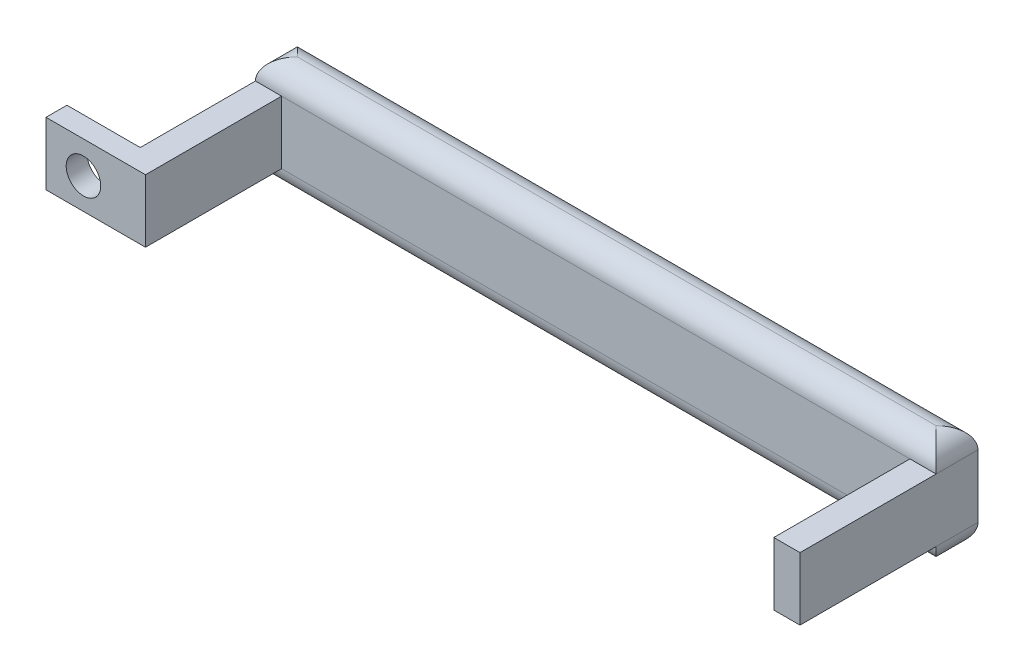
ISO-10303-21;
HEADER;
FILE_DESCRIPTION(('STEP AP214'),'2;1');
FILE_NAME('part.step','',(''),(''),'','','');
FILE_SCHEMA(('AUTOMOTIVE_DESIGN { 1 0 10303 214 1 1 1 1 }'));
ENDSEC;
DATA;
#1=APPLICATION_CONTEXT('core data for automotive mechanical design processes');
#2=APPLICATION_PROTOCOL_DEFINITION('international standard','automotive_design',2000,#1);
#3=PRODUCT_CONTEXT('',#1,'mechanical');
#4=PRODUCT('Part','Part','',(#3));
#5=PRODUCT_RELATED_PRODUCT_CATEGORY('part','',(#4));
#6=PRODUCT_DEFINITION_FORMATION('','',#4);
#7=PRODUCT_DEFINITION_CONTEXT('part definition',#1,'design');
#8=PRODUCT_DEFINITION('design','',#6,#7);
#9=PRODUCT_DEFINITION_SHAPE('','',#8);
#10=(LENGTH_UNIT() NAMED_UNIT(*) SI_UNIT(.MILLI.,.METRE.));
#11=(NAMED_UNIT(*) PLANE_ANGLE_UNIT() SI_UNIT($,.RADIAN.));
#12=(NAMED_UNIT(*) SI_UNIT($,.STERADIAN.) SOLID_ANGLE_UNIT());
#13=UNCERTAINTY_MEASURE_WITH_UNIT(LENGTH_MEASURE(1.E-05),#10,'distance_accuracy_value','');
#14=(GEOMETRIC_REPRESENTATION_CONTEXT(3) GLOBAL_UNCERTAINTY_ASSIGNED_CONTEXT((#13)) GLOBAL_UNIT_ASSIGNED_CONTEXT((#10,
#11,#12)) REPRESENTATION_CONTEXT('',''));
#15=CARTESIAN_POINT('',(0.,0.,0.));
#16=DIRECTION('',(0.,0.,1.));
#17=DIRECTION('',(1.,0.,0.));
#18=AXIS2_PLACEMENT_3D('',#15,#16,#17);
#19=CARTESIAN_POINT('',(0.,0.,4.));
#20=DIRECTION('',(0.,0.,1.));
#21=DIRECTION('',(1.,0.,0.));
#22=AXIS2_PLACEMENT_3D('',#19,#20,#21);
#23=PLANE('',#22);
#24=DIRECTION('',(-1.,0.,0.));
#25=VECTOR('',#24,1.);
#26=CARTESIAN_POINT('',(-38.0590062111801,10.1583850931677,4.));
#27=LINE('',#26,#25);
#28=CARTESIAN_POINT('',(24.4409937888199,10.1583850931677,4.));
#29=VERTEX_POINT('',#28);
#30=CARTESIAN_POINT('',(-35.5590062111801,10.1583850931677,4.));
#31=VERTEX_POINT('',#30);
#32=EDGE_CURVE('E225',#29,#31,#27,.T.);
#33=ORIENTED_EDGE('',*,*,#32,.T.);
#34=DIRECTION('',(0.,1.,0.));
#35=VECTOR('',#34,1.);
#36=CARTESIAN_POINT('',(-35.5590062111801,10.1583850931677,4.));
#37=LINE('',#36,#35);
#38=CARTESIAN_POINT('',(-35.5590062111801,4.1583850931677,4.));
#39=VERTEX_POINT('',#38);
#40=EDGE_CURVE('E201',#39,#31,#37,.T.);
#41=ORIENTED_EDGE('',*,*,#40,.F.);
#42=DIRECTION('',(1.,0.,0.));
#43=VECTOR('',#42,1.);
#44=CARTESIAN_POINT('',(26.9409937888199,4.1583850931677,4.));
#45=LINE('',#44,#43);
#46=CARTESIAN_POINT('',(24.4409937888199,4.1583850931677,4.));
#47=VERTEX_POINT('',#46);
#48=EDGE_CURVE('E221',#39,#47,#45,.T.);
#49=ORIENTED_EDGE('',*,*,#48,.T.);
#50=DIRECTION('',(0.,-1.,0.));
#51=VECTOR('',#50,1.);
#52=CARTESIAN_POINT('',(24.4409937888199,10.1583850931677,4.));
#53=LINE('',#52,#51);
#54=EDGE_CURVE('E65',#29,#47,#53,.T.);
#55=ORIENTED_EDGE('',*,*,#54,.F.);
#56=EDGE_LOOP('',(#33,#41,#49,#55));
#57=FACE_BOUND('',#56,.T.);
#58=ADVANCED_FACE('F41',(#57),#23,.T.);
#59=CARTESIAN_POINT('',(-38.0590062111801,12.1583850931677,4.));
#60=DIRECTION('',(1.,0.,0.));
#61=DIRECTION('',(0.,0.,-1.));
#62=AXIS2_PLACEMENT_3D('',#59,#60,#61);
#63=PLANE('',#62);
#64=DIRECTION('',(0.,0.,-1.));
#65=VECTOR('',#64,1.);
#66=CARTESIAN_POINT('',(-38.0590062111801,4.1583850931677,17.));
#67=LINE('',#66,#65);
#68=CARTESIAN_POINT('',(-38.0590062111801,4.1583850931677,15.));
#69=VERTEX_POINT('',#68);
#70=CARTESIAN_POINT('',(-38.0590062111801,4.1583850931677,4.));
#71=VERTEX_POINT('',#70);
#72=EDGE_CURVE('E163',#69,#71,#67,.T.);
#73=ORIENTED_EDGE('',*,*,#72,.F.);
#74=DIRECTION('',(0.,1.,0.));
#75=VECTOR('',#74,1.);
#76=CARTESIAN_POINT('',(-38.0590062111801,10.1583850931677,15.));
#77=LINE('',#76,#75);
#78=CARTESIAN_POINT('',(-38.0590062111801,10.1583850931677,15.));
#79=VERTEX_POINT('',#78);
#80=EDGE_CURVE('E149',#69,#79,#77,.T.);
#81=ORIENTED_EDGE('',*,*,#80,.T.);
#82=DIRECTION('',(0.,0.,-1.));
#83=VECTOR('',#82,1.);
#84=CARTESIAN_POINT('',(-38.0590062111801,10.1583850931677,17.));
#85=LINE('',#84,#83);
#86=CARTESIAN_POINT('',(-38.0590062111801,10.1583850931677,4.));
#87=VERTEX_POINT('',#86);
#88=EDGE_CURVE('E160',#79,#87,#85,.T.);
#89=ORIENTED_EDGE('',*,*,#88,.T.);
#90=DIRECTION('',(0.,0.,-1.));
#91=VECTOR('',#90,1.);
#92=CARTESIAN_POINT('',(-38.0590062111801,10.1583850931677,4.));
#93=LINE('',#92,#91);
#94=CARTESIAN_POINT('',(-38.0590062111801,10.1583850931677,0.));
#95=VERTEX_POINT('',#94);
#96=EDGE_CURVE('E231',#87,#95,#93,.T.);
#97=ORIENTED_EDGE('',*,*,#96,.T.);
#98=DIRECTION('',(0.,-1.,0.));
#99=VECTOR('',#98,1.);
#100=CARTESIAN_POINT('',(-38.0590062111801,12.1583850931677,0.));
#101=LINE('',#100,#99);
#102=CARTESIAN_POINT('',(-38.0590062111801,4.1583850931677,0.));
#103=VERTEX_POINT('',#102);
#104=EDGE_CURVE('E209',#95,#103,#101,.T.);
#105=ORIENTED_EDGE('',*,*,#104,.T.);
#106=DIRECTION('',(0.,0.,-1.));
#107=VECTOR('',#106,1.);
#108=CARTESIAN_POINT('',(-38.0590062111801,4.1583850931677,4.));
#109=LINE('',#108,#107);
#110=EDGE_CURVE('E229',#103,#71,#109,.F.);
#111=ORIENTED_EDGE('',*,*,#110,.T.);
#112=EDGE_LOOP('',(#73,#81,#89,#97,#105,#111));
#113=FACE_BOUND('',#112,.T.);
#114=ADVANCED_FACE('F159',(#113),#63,.F.);
#115=CARTESIAN_POINT('',(26.9409937888199,12.1583850931677,4.));
#116=DIRECTION('',(-1.,0.,0.));
#117=DIRECTION('',(0.,0.,1.));
#118=AXIS2_PLACEMENT_3D('',#115,#116,#117);
#119=PLANE('',#118);
#120=DIRECTION('',(0.,1.,0.));
#121=VECTOR('',#120,1.);
#122=CARTESIAN_POINT('',(26.9409937888199,12.1583850931677,0.));
#123=LINE('',#122,#121);
#124=CARTESIAN_POINT('',(26.9409937888199,4.1583850931677,0.));
#125=VERTEX_POINT('',#124);
#126=CARTESIAN_POINT('',(26.9409937888199,10.1583850931677,0.));
#127=VERTEX_POINT('',#126);
#128=EDGE_CURVE('E212',#125,#127,#123,.T.);
#129=ORIENTED_EDGE('',*,*,#128,.T.);
#130=DIRECTION('',(0.,0.,-1.));
#131=VECTOR('',#130,1.);
#132=CARTESIAN_POINT('',(26.9409937888199,10.1583850931677,4.));
#133=LINE('',#132,#131);
#134=CARTESIAN_POINT('',(26.9409937888199,10.1583850931677,4.));
#135=VERTEX_POINT('',#134);
#136=EDGE_CURVE('E218',#127,#135,#133,.F.);
#137=ORIENTED_EDGE('',*,*,#136,.T.);
#138=DIRECTION('',(0.,0.,-1.));
#139=VECTOR('',#138,1.);
#140=CARTESIAN_POINT('',(26.9409937888199,10.1583850931677,17.));
#141=LINE('',#140,#139);
#142=CARTESIAN_POINT('',(26.9409937888199,10.1583850931677,17.));
#143=VERTEX_POINT('',#142);
#144=EDGE_CURVE('E182',#143,#135,#141,.T.);
#145=ORIENTED_EDGE('',*,*,#144,.F.);
#146=DIRECTION('',(0.,1.,0.));
#147=VECTOR('',#146,1.);
#148=CARTESIAN_POINT('',(26.9409937888199,10.1583850931677,17.));
#149=LINE('',#148,#147);
#150=CARTESIAN_POINT('',(26.9409937888199,4.1583850931677,17.));
#151=VERTEX_POINT('',#150);
#152=EDGE_CURVE('E199',#151,#143,#149,.T.);
#153=ORIENTED_EDGE('',*,*,#152,.F.);
#154=DIRECTION('',(0.,0.,-1.));
#155=VECTOR('',#154,1.);
#156=CARTESIAN_POINT('',(26.9409937888199,4.1583850931677,17.));
#157=LINE('',#156,#155);
#158=CARTESIAN_POINT('',(26.9409937888199,4.1583850931677,4.));
#159=VERTEX_POINT('',#158);
#160=EDGE_CURVE('E192',#151,#159,#157,.T.);
#161=ORIENTED_EDGE('',*,*,#160,.T.);
#162=DIRECTION('',(0.,0.,-1.));
#163=VECTOR('',#162,1.);
#164=CARTESIAN_POINT('',(26.9409937888199,4.1583850931677,4.));
#165=LINE('',#164,#163);
#166=EDGE_CURVE('E216',#159,#125,#165,.T.);
#167=ORIENTED_EDGE('',*,*,#166,.T.);
#168=EDGE_LOOP('',(#129,#137,#145,#153,#161,#167));
#169=FACE_BOUND('',#168,.T.);
#170=ADVANCED_FACE('F271',(#169),#119,.F.);
#171=CARTESIAN_POINT('',(0.,0.,0.));
#172=DIRECTION('',(0.,0.,1.));
#173=DIRECTION('',(1.,0.,0.));
#174=AXIS2_PLACEMENT_3D('',#171,#172,#173);
#175=PLANE('',#174);
#176=ORIENTED_EDGE('',*,*,#104,.F.);
#177=DIRECTION('',(-1.,0.,0.));
#178=VECTOR('',#177,1.);
#179=CARTESIAN_POINT('',(0.,10.1583850931677,0.));
#180=LINE('',#179,#178);
#181=EDGE_CURVE('E11',#95,#127,#180,.F.);
#182=ORIENTED_EDGE('',*,*,#181,.T.);
#183=ORIENTED_EDGE('',*,*,#128,.F.);
#184=DIRECTION('',(1.,0.,0.));
#185=VECTOR('',#184,1.);
#186=CARTESIAN_POINT('',(0.,4.1583850931677,0.));
#187=LINE('',#186,#185);
#188=EDGE_CURVE('E50',#125,#103,#187,.F.);
#189=ORIENTED_EDGE('',*,*,#188,.T.);
#190=EDGE_LOOP('',(#176,#182,#183,#189));
#191=FACE_BOUND('',#190,.T.);
#192=ADVANCED_FACE('F298',(#191),#175,.F.);
#193=CARTESIAN_POINT('',(-36.0590062111801,10.1583850931677,4.));
#194=DIRECTION('',(0.,0.,-1.));
#195=DIRECTION('',(-1.,0.,0.));
#196=AXIS2_PLACEMENT_3D('',#193,#194,#195);
#197=CYLINDRICAL_SURFACE('',#196,2.);
#198=CARTESIAN_POINT('',(-36.0590062111801,10.1583850931677,2.));
#199=DIRECTION('',(-0.707106781186547,0.,0.707106781186547));
#200=DIRECTION('',(-0.707106781186547,0.,-0.707106781186547));
#201=AXIS2_PLACEMENT_3D('',#198,#199,#200);
#202=ELLIPSE('',#201,2.82842712474619,2.);
#203=CARTESIAN_POINT('',(-36.0590062111801,12.1583850931677,2.));
#204=VERTEX_POINT('',#203);
#205=EDGE_CURVE('E239',#95,#204,#202,.F.);
#206=ORIENTED_EDGE('',*,*,#205,.F.);
#207=ORIENTED_EDGE('',*,*,#96,.F.);
#208=CARTESIAN_POINT('',(-36.0590062111801,10.1583850931677,2.));
#209=DIRECTION('',(-0.707106781186547,0.,-0.707106781186547));
#210=DIRECTION('',(0.707106781186547,0.,-0.707106781186547));
#211=AXIS2_PLACEMENT_3D('',#208,#209,#210);
#212=ELLIPSE('',#211,2.82842712474619,2.);
#213=EDGE_CURVE('E213',#204,#87,#212,.F.);
#214=ORIENTED_EDGE('',*,*,#213,.F.);
#215=EDGE_LOOP('',(#206,#207,#214));
#216=FACE_BOUND('',#215,.T.);
#217=ADVANCED_FACE('F294',(#216),#197,.T.);
#218=CARTESIAN_POINT('',(0.,10.1583850931677,2.));
#219=DIRECTION('',(1.,0.,0.));
#220=DIRECTION('',(0.,0.,-1.));
#221=AXIS2_PLACEMENT_3D('',#218,#219,#220);
#222=CYLINDRICAL_SURFACE('',#221,2.);
#223=DIRECTION('',(-1.,0.,0.));
#224=VECTOR('',#223,1.);
#225=CARTESIAN_POINT('',(26.9409937888199,12.1583850931677,2.));
#226=LINE('',#225,#224);
#227=CARTESIAN_POINT('',(24.9409937888199,12.1583850931677,2.));
#228=VERTEX_POINT('',#227);
#229=EDGE_CURVE('E242',#204,#228,#226,.F.);
#230=ORIENTED_EDGE('',*,*,#229,.F.);
#231=ORIENTED_EDGE('',*,*,#213,.T.);
#232=DIRECTION('',(-1.,0.,0.));
#233=VECTOR('',#232,1.);
#234=CARTESIAN_POINT('',(-38.0590062111801,10.1583850931677,4.));
#235=LINE('',#234,#233);
#236=EDGE_CURVE('E58',#31,#87,#235,.T.);
#237=ORIENTED_EDGE('',*,*,#236,.F.);
#238=ORIENTED_EDGE('',*,*,#32,.F.);
#239=EDGE_CURVE('E226',#135,#29,#27,.T.);
#240=ORIENTED_EDGE('',*,*,#239,.F.);
#241=CARTESIAN_POINT('',(24.9409937888199,10.1583850931677,2.));
#242=DIRECTION('',(0.707106781186547,0.,-0.707106781186547));
#243=DIRECTION('',(0.707106781186547,0.,0.707106781186547));
#244=AXIS2_PLACEMENT_3D('',#241,#242,#243);
#245=ELLIPSE('',#244,2.82842712474619,2.);
#246=EDGE_CURVE('E237',#228,#135,#245,.T.);
#247=ORIENTED_EDGE('',*,*,#246,.F.);
#248=EDGE_LOOP('',(#230,#231,#237,#238,#240,#247));
#249=FACE_BOUND('',#248,.T.);
#250=ADVANCED_FACE('F284',(#249),#222,.T.);
#251=CARTESIAN_POINT('',(-38.0590062111801,10.1583850931677,2.));
#252=DIRECTION('',(-1.,0.,0.));
#253=DIRECTION('',(0.,0.,1.));
#254=AXIS2_PLACEMENT_3D('',#251,#252,#253);
#255=CYLINDRICAL_SURFACE('',#254,2.);
#256=ORIENTED_EDGE('',*,*,#205,.T.);
#257=ORIENTED_EDGE('',*,*,#229,.T.);
#258=CARTESIAN_POINT('',(24.9409937888199,10.1583850931677,2.));
#259=DIRECTION('',(-0.707106781186547,0.,-0.707106781186547));
#260=DIRECTION('',(-0.707106781186547,0.,0.707106781186547));
#261=AXIS2_PLACEMENT_3D('',#258,#259,#260);
#262=ELLIPSE('',#261,2.82842712474619,2.);
#263=EDGE_CURVE('E234',#127,#228,#262,.F.);
#264=ORIENTED_EDGE('',*,*,#263,.F.);
#265=ORIENTED_EDGE('',*,*,#181,.F.);
#266=EDGE_LOOP('',(#256,#257,#264,#265));
#267=FACE_BOUND('',#266,.T.);
#268=ADVANCED_FACE('F291',(#267),#255,.T.);
#269=CARTESIAN_POINT('',(24.9409937888199,10.1583850931677,4.));
#270=DIRECTION('',(0.,0.,-1.));
#271=DIRECTION('',(-1.,0.,0.));
#272=AXIS2_PLACEMENT_3D('',#269,#270,#271);
#273=CYLINDRICAL_SURFACE('',#272,2.);
#274=ORIENTED_EDGE('',*,*,#246,.T.);
#275=ORIENTED_EDGE('',*,*,#136,.F.);
#276=ORIENTED_EDGE('',*,*,#263,.T.);
#277=EDGE_LOOP('',(#274,#275,#276));
#278=FACE_BOUND('',#277,.T.);
#279=ADVANCED_FACE('F288',(#278),#273,.T.);
#280=CARTESIAN_POINT('',(24.9409937888199,4.1583850931677,4.));
#281=DIRECTION('',(0.,0.,-1.));
#282=DIRECTION('',(-1.,0.,0.));
#283=AXIS2_PLACEMENT_3D('',#280,#281,#282);
#284=CYLINDRICAL_SURFACE('',#283,2.);
#285=CARTESIAN_POINT('',(24.9409937888199,4.1583850931677,2.));
#286=DIRECTION('',(0.707106781186547,0.,0.707106781186547));
#287=DIRECTION('',(0.707106781186547,0.,-0.707106781186547));
#288=AXIS2_PLACEMENT_3D('',#285,#286,#287);
#289=ELLIPSE('',#288,2.82842712474619,2.);
#290=CARTESIAN_POINT('',(24.9409937888199,2.1583850931677,2.));
#291=VERTEX_POINT('',#290);
#292=EDGE_CURVE('E250',#125,#291,#289,.F.);
#293=ORIENTED_EDGE('',*,*,#292,.F.);
#294=ORIENTED_EDGE('',*,*,#166,.F.);
#295=CARTESIAN_POINT('',(24.9409937888199,4.1583850931677,2.));
#296=DIRECTION('',(0.707106781186547,0.,-0.707106781186547));
#297=DIRECTION('',(-0.707106781186547,0.,-0.707106781186547));
#298=AXIS2_PLACEMENT_3D('',#295,#296,#297);
#299=ELLIPSE('',#298,2.82842712474619,2.);
#300=EDGE_CURVE('E45',#291,#159,#299,.F.);
#301=ORIENTED_EDGE('',*,*,#300,.F.);
#302=EDGE_LOOP('',(#293,#294,#301));
#303=FACE_BOUND('',#302,.T.);
#304=ADVANCED_FACE('F43',(#303),#284,.T.);
#305=CARTESIAN_POINT('',(0.,4.1583850931677,2.));
#306=DIRECTION('',(-1.,0.,0.));
#307=DIRECTION('',(0.,-1.,0.));
#308=AXIS2_PLACEMENT_3D('',#305,#306,#307);
#309=CYLINDRICAL_SURFACE('',#308,2.);
#310=DIRECTION('',(1.,0.,0.));
#311=VECTOR('',#310,1.);
#312=CARTESIAN_POINT('',(-38.0590062111801,2.1583850931677,2.));
#313=LINE('',#312,#311);
#314=CARTESIAN_POINT('',(-36.0590062111801,2.1583850931677,2.));
#315=VERTEX_POINT('',#314);
#316=EDGE_CURVE('E252',#291,#315,#313,.F.);
#317=ORIENTED_EDGE('',*,*,#316,.F.);
#318=ORIENTED_EDGE('',*,*,#300,.T.);
#319=DIRECTION('',(1.,0.,0.));
#320=VECTOR('',#319,1.);
#321=CARTESIAN_POINT('',(26.9409937888199,4.1583850931677,4.));
#322=LINE('',#321,#320);
#323=EDGE_CURVE('E196',#47,#159,#322,.T.);
#324=ORIENTED_EDGE('',*,*,#323,.F.);
#325=ORIENTED_EDGE('',*,*,#48,.F.);
#326=EDGE_CURVE('E222',#71,#39,#45,.T.);
#327=ORIENTED_EDGE('',*,*,#326,.F.);
#328=CARTESIAN_POINT('',(-36.0590062111801,4.1583850931677,2.));
#329=DIRECTION('',(-0.707106781186547,0.,-0.707106781186547));
#330=DIRECTION('',(-0.707106781186547,0.,0.707106781186547));
#331=AXIS2_PLACEMENT_3D('',#328,#329,#330);
#332=ELLIPSE('',#331,2.82842712474619,2.);
#333=EDGE_CURVE('E247',#315,#71,#332,.T.);
#334=ORIENTED_EDGE('',*,*,#333,.F.);
#335=EDGE_LOOP('',(#317,#318,#324,#325,#327,#334));
#336=FACE_BOUND('',#335,.T.);
#337=ADVANCED_FACE('F259',(#336),#309,.T.);
#338=CARTESIAN_POINT('',(-38.0590062111801,4.1583850931677,2.));
#339=DIRECTION('',(1.,0.,0.));
#340=DIRECTION('',(0.,1.,0.));
#341=AXIS2_PLACEMENT_3D('',#338,#339,#340);
#342=CYLINDRICAL_SURFACE('',#341,2.);
#343=ORIENTED_EDGE('',*,*,#292,.T.);
#344=ORIENTED_EDGE('',*,*,#316,.T.);
#345=CARTESIAN_POINT('',(-36.0590062111801,4.1583850931677,2.));
#346=DIRECTION('',(0.707106781186547,0.,-0.707106781186547));
#347=DIRECTION('',(0.707106781186547,0.,0.707106781186547));
#348=AXIS2_PLACEMENT_3D('',#345,#346,#347);
#349=ELLIPSE('',#348,2.82842712474619,2.);
#350=EDGE_CURVE('E181',#103,#315,#349,.F.);
#351=ORIENTED_EDGE('',*,*,#350,.F.);
#352=ORIENTED_EDGE('',*,*,#188,.F.);
#353=EDGE_LOOP('',(#343,#344,#351,#352));
#354=FACE_BOUND('',#353,.T.);
#355=ADVANCED_FACE('F299',(#354),#342,.T.);
#356=CARTESIAN_POINT('',(-36.0590062111801,4.1583850931677,4.));
#357=DIRECTION('',(0.,0.,-1.));
#358=DIRECTION('',(-1.,0.,0.));
#359=AXIS2_PLACEMENT_3D('',#356,#357,#358);
#360=CYLINDRICAL_SURFACE('',#359,2.);
#361=ORIENTED_EDGE('',*,*,#333,.T.);
#362=ORIENTED_EDGE('',*,*,#110,.F.);
#363=ORIENTED_EDGE('',*,*,#350,.T.);
#364=EDGE_LOOP('',(#361,#362,#363));
#365=FACE_BOUND('',#364,.T.);
#366=ADVANCED_FACE('F301',(#365),#360,.T.);
#367=CARTESIAN_POINT('',(26.9409937888199,10.1583850931677,17.));
#368=DIRECTION('',(0.,-1.,0.));
#369=DIRECTION('',(0.,0.,-1.));
#370=AXIS2_PLACEMENT_3D('',#367,#368,#369);
#371=PLANE('',#370);
#372=ORIENTED_EDGE('',*,*,#239,.T.);
#373=DIRECTION('',(0.,0.,-1.));
#374=VECTOR('',#373,1.);
#375=CARTESIAN_POINT('',(24.4409937888199,10.1583850931677,17.));
#376=LINE('',#375,#374);
#377=CARTESIAN_POINT('',(24.4409937888199,10.1583850931677,17.));
#378=VERTEX_POINT('',#377);
#379=EDGE_CURVE('E185',#378,#29,#376,.T.);
#380=ORIENTED_EDGE('',*,*,#379,.F.);
#381=DIRECTION('',(-1.,0.,0.));
#382=VECTOR('',#381,1.);
#383=CARTESIAN_POINT('',(26.9409937888199,10.1583850931677,17.));
#384=LINE('',#383,#382);
#385=EDGE_CURVE('E205',#143,#378,#384,.T.);
#386=ORIENTED_EDGE('',*,*,#385,.F.);
#387=ORIENTED_EDGE('',*,*,#144,.T.);
#388=EDGE_LOOP('',(#372,#380,#386,#387));
#389=FACE_BOUND('',#388,.T.);
#390=ADVANCED_FACE('F280',(#389),#371,.F.);
#391=CARTESIAN_POINT('',(24.4409937888199,10.1583850931677,17.));
#392=DIRECTION('',(1.,0.,0.));
#393=DIRECTION('',(0.,0.,-1.));
#394=AXIS2_PLACEMENT_3D('',#391,#392,#393);
#395=PLANE('',#394);
#396=ORIENTED_EDGE('',*,*,#54,.T.);
#397=DIRECTION('',(0.,0.,-1.));
#398=VECTOR('',#397,1.);
#399=CARTESIAN_POINT('',(24.4409937888199,4.1583850931677,17.));
#400=LINE('',#399,#398);
#401=CARTESIAN_POINT('',(24.4409937888199,4.1583850931677,17.));
#402=VERTEX_POINT('',#401);
#403=EDGE_CURVE('E189',#402,#47,#400,.T.);
#404=ORIENTED_EDGE('',*,*,#403,.F.);
#405=DIRECTION('',(0.,-1.,0.));
#406=VECTOR('',#405,1.);
#407=CARTESIAN_POINT('',(24.4409937888199,10.1583850931677,17.));
#408=LINE('',#407,#406);
#409=EDGE_CURVE('E203',#378,#402,#408,.T.);
#410=ORIENTED_EDGE('',*,*,#409,.F.);
#411=ORIENTED_EDGE('',*,*,#379,.T.);
#412=EDGE_LOOP('',(#396,#404,#410,#411));
#413=FACE_BOUND('',#412,.T.);
#414=ADVANCED_FACE('F278',(#413),#395,.F.);
#415=CARTESIAN_POINT('',(26.9409937888199,4.1583850931677,17.));
#416=DIRECTION('',(0.,1.,0.));
#417=DIRECTION('',(-1.,0.,0.));
#418=AXIS2_PLACEMENT_3D('',#415,#416,#417);
#419=PLANE('',#418);
#420=ORIENTED_EDGE('',*,*,#323,.T.);
#421=ORIENTED_EDGE('',*,*,#160,.F.);
#422=DIRECTION('',(1.,0.,0.));
#423=VECTOR('',#422,1.);
#424=CARTESIAN_POINT('',(26.9409937888199,4.1583850931677,17.));
#425=LINE('',#424,#423);
#426=EDGE_CURVE('E195',#402,#151,#425,.T.);
#427=ORIENTED_EDGE('',*,*,#426,.F.);
#428=ORIENTED_EDGE('',*,*,#403,.T.);
#429=EDGE_LOOP('',(#420,#421,#427,#428));
#430=FACE_BOUND('',#429,.T.);
#431=ADVANCED_FACE('F267',(#430),#419,.F.);
#432=CARTESIAN_POINT('',(0.,0.,17.));
#433=DIRECTION('',(0.,0.,-1.));
#434=DIRECTION('',(-1.,0.,0.));
#435=AXIS2_PLACEMENT_3D('',#432,#433,#434);
#436=PLANE('',#435);
#437=ORIENTED_EDGE('',*,*,#152,.T.);
#438=ORIENTED_EDGE('',*,*,#385,.T.);
#439=ORIENTED_EDGE('',*,*,#409,.T.);
#440=ORIENTED_EDGE('',*,*,#426,.T.);
#441=EDGE_LOOP('',(#437,#438,#439,#440));
#442=FACE_BOUND('',#441,.T.);
#443=ADVANCED_FACE('F274',(#442),#436,.F.);
#444=CARTESIAN_POINT('',(-38.0590062111801,4.1583850931677,17.));
#445=DIRECTION('',(0.,1.,0.));
#446=DIRECTION('',(0.,0.,1.));
#447=AXIS2_PLACEMENT_3D('',#444,#445,#446);
#448=PLANE('',#447);
#449=ORIENTED_EDGE('',*,*,#326,.T.);
#450=DIRECTION('',(0.,0.,-1.));
#451=VECTOR('',#450,1.);
#452=CARTESIAN_POINT('',(-35.5590062111801,4.1583850931677,17.));
#453=LINE('',#452,#451);
#454=CARTESIAN_POINT('',(-35.5590062111801,4.1583850931677,17.));
#455=VERTEX_POINT('',#454);
#456=EDGE_CURVE('E171',#455,#39,#453,.T.);
#457=ORIENTED_EDGE('',*,*,#456,.F.);
#458=DIRECTION('',(1.,0.,0.));
#459=VECTOR('',#458,1.);
#460=CARTESIAN_POINT('',(-38.0590062111801,4.1583850931677,17.));
#461=LINE('',#460,#459);
#462=CARTESIAN_POINT('',(-45.0590062111801,4.1583850931677,17.));
#463=VERTEX_POINT('',#462);
#464=EDGE_CURVE('E314',#463,#455,#461,.T.);
#465=ORIENTED_EDGE('',*,*,#464,.F.);
#466=DIRECTION('',(0.,0.,1.));
#467=VECTOR('',#466,1.);
#468=CARTESIAN_POINT('',(-45.0590062111801,4.1583850931677,15.));
#469=LINE('',#468,#467);
#470=CARTESIAN_POINT('',(-45.0590062111801,4.1583850931677,15.));
#471=VERTEX_POINT('',#470);
#472=EDGE_CURVE('E186',#471,#463,#469,.T.);
#473=ORIENTED_EDGE('',*,*,#472,.F.);
#474=DIRECTION('',(1.,0.,0.));
#475=VECTOR('',#474,1.);
#476=CARTESIAN_POINT('',(-38.0590062111801,4.1583850931677,15.));
#477=LINE('',#476,#475);
#478=EDGE_CURVE('E320',#471,#69,#477,.T.);
#479=ORIENTED_EDGE('',*,*,#478,.T.);
#480=ORIENTED_EDGE('',*,*,#72,.T.);
#481=EDGE_LOOP('',(#449,#457,#465,#473,#479,#480));
#482=FACE_BOUND('',#481,.T.);
#483=ADVANCED_FACE('F306',(#482),#448,.F.);
#484=CARTESIAN_POINT('',(-35.5590062111801,10.1583850931677,17.));
#485=DIRECTION('',(-1.,0.,0.));
#486=DIRECTION('',(0.,0.,1.));
#487=AXIS2_PLACEMENT_3D('',#484,#485,#486);
#488=PLANE('',#487);
#489=ORIENTED_EDGE('',*,*,#40,.T.);
#490=DIRECTION('',(0.,0.,-1.));
#491=VECTOR('',#490,1.);
#492=CARTESIAN_POINT('',(-35.5590062111801,10.1583850931677,17.));
#493=LINE('',#492,#491);
#494=CARTESIAN_POINT('',(-35.5590062111801,10.1583850931677,17.));
#495=VERTEX_POINT('',#494);
#496=EDGE_CURVE('E168',#495,#31,#493,.T.);
#497=ORIENTED_EDGE('',*,*,#496,.F.);
#498=DIRECTION('',(0.,1.,0.));
#499=VECTOR('',#498,1.);
#500=CARTESIAN_POINT('',(-35.5590062111801,10.1583850931677,17.));
#501=LINE('',#500,#499);
#502=EDGE_CURVE('E173',#455,#495,#501,.T.);
#503=ORIENTED_EDGE('',*,*,#502,.F.);
#504=ORIENTED_EDGE('',*,*,#456,.T.);
#505=EDGE_LOOP('',(#489,#497,#503,#504));
#506=FACE_BOUND('',#505,.T.);
#507=ADVANCED_FACE('F310',(#506),#488,.F.);
#508=CARTESIAN_POINT('',(-38.0590062111801,10.1583850931677,17.));
#509=DIRECTION('',(0.,-1.,0.));
#510=DIRECTION('',(0.,0.,-1.));
#511=AXIS2_PLACEMENT_3D('',#508,#509,#510);
#512=PLANE('',#511);
#513=ORIENTED_EDGE('',*,*,#236,.T.);
#514=ORIENTED_EDGE('',*,*,#88,.F.);
#515=DIRECTION('',(-1.,0.,0.));
#516=VECTOR('',#515,1.);
#517=CARTESIAN_POINT('',(-38.0590062111801,10.1583850931677,15.));
#518=LINE('',#517,#516);
#519=CARTESIAN_POINT('',(-45.0590062111801,10.1583850931677,15.));
#520=VERTEX_POINT('',#519);
#521=EDGE_CURVE('E145',#79,#520,#518,.T.);
#522=ORIENTED_EDGE('',*,*,#521,.T.);
#523=DIRECTION('',(0.,0.,1.));
#524=VECTOR('',#523,1.);
#525=CARTESIAN_POINT('',(-45.0590062111801,10.1583850931677,15.));
#526=LINE('',#525,#524);
#527=CARTESIAN_POINT('',(-45.0590062111801,10.1583850931677,17.));
#528=VERTEX_POINT('',#527);
#529=EDGE_CURVE('E318',#520,#528,#526,.T.);
#530=ORIENTED_EDGE('',*,*,#529,.T.);
#531=DIRECTION('',(-1.,0.,0.));
#532=VECTOR('',#531,1.);
#533=CARTESIAN_POINT('',(-38.0590062111801,10.1583850931677,17.));
#534=LINE('',#533,#532);
#535=EDGE_CURVE('E169',#495,#528,#534,.T.);
#536=ORIENTED_EDGE('',*,*,#535,.F.);
#537=ORIENTED_EDGE('',*,*,#496,.T.);
#538=EDGE_LOOP('',(#513,#514,#522,#530,#536,#537));
#539=FACE_BOUND('',#538,.T.);
#540=ADVANCED_FACE('F166',(#539),#512,.F.);
#541=CARTESIAN_POINT('',(0.,0.,17.));
#542=DIRECTION('',(0.,0.,1.));
#543=DIRECTION('',(1.,0.,0.));
#544=AXIS2_PLACEMENT_3D('',#541,#542,#543);
#545=PLANE('',#544);
#546=ORIENTED_EDGE('',*,*,#535,.T.);
#547=DIRECTION('',(0.,-1.,0.));
#548=VECTOR('',#547,1.);
#549=CARTESIAN_POINT('',(-45.0590062111801,10.1583850931677,17.));
#550=LINE('',#549,#548);
#551=EDGE_CURVE('E164',#528,#463,#550,.T.);
#552=ORIENTED_EDGE('',*,*,#551,.T.);
#553=ORIENTED_EDGE('',*,*,#464,.T.);
#554=ORIENTED_EDGE('',*,*,#502,.T.);
#555=EDGE_LOOP('',(#546,#552,#553,#554));
#556=FACE_BOUND('',#555,.T.);
#557=CARTESIAN_POINT('',(-41.4825565518478,7.09285681374001,17.));
#558=DIRECTION('',(0.,0.,1.));
#559=DIRECTION('',(1.,0.,0.));
#560=AXIS2_PLACEMENT_3D('',#557,#558,#559);
#561=CIRCLE('',#560,1.65);
#562=CARTESIAN_POINT('',(-39.8325565518478,7.09285681374001,17.));
#563=VERTEX_POINT('',#562);
#564=EDGE_CURVE('E328',#563,#563,#561,.T.);
#565=ORIENTED_EDGE('',*,*,#564,.F.);
#566=EDGE_LOOP('',(#565));
#567=FACE_BOUND('',#566,.T.);
#568=ADVANCED_FACE('F341',(#556,#567),#545,.T.);
#569=CARTESIAN_POINT('',(-45.0590062111801,10.1583850931677,15.));
#570=DIRECTION('',(-1.,0.,0.));
#571=DIRECTION('',(0.,0.,1.));
#572=AXIS2_PLACEMENT_3D('',#569,#570,#571);
#573=PLANE('',#572);
#574=ORIENTED_EDGE('',*,*,#551,.F.);
#575=ORIENTED_EDGE('',*,*,#529,.F.);
#576=DIRECTION('',(0.,-1.,0.));
#577=VECTOR('',#576,1.);
#578=CARTESIAN_POINT('',(-45.0590062111801,10.1583850931677,15.));
#579=LINE('',#578,#577);
#580=EDGE_CURVE('E152',#520,#471,#579,.T.);
#581=ORIENTED_EDGE('',*,*,#580,.T.);
#582=ORIENTED_EDGE('',*,*,#472,.T.);
#583=EDGE_LOOP('',(#574,#575,#581,#582));
#584=FACE_BOUND('',#583,.T.);
#585=ADVANCED_FACE('F343',(#584),#573,.T.);
#586=CARTESIAN_POINT('',(0.,0.,15.));
#587=DIRECTION('',(0.,0.,-1.));
#588=DIRECTION('',(-1.,0.,0.));
#589=AXIS2_PLACEMENT_3D('',#586,#587,#588);
#590=PLANE('',#589);
#591=CARTESIAN_POINT('',(-41.4825565518478,7.09285681374001,15.));
#592=DIRECTION('',(0.,0.,1.));
#593=DIRECTION('',(1.,0.,0.));
#594=AXIS2_PLACEMENT_3D('',#591,#592,#593);
#595=CIRCLE('',#594,1.65);
#596=CARTESIAN_POINT('',(-39.8325565518478,7.09285681374001,15.));
#597=VERTEX_POINT('',#596);
#598=EDGE_CURVE('E325',#597,#597,#595,.T.);
#599=ORIENTED_EDGE('',*,*,#598,.T.);
#600=EDGE_LOOP('',(#599));
#601=FACE_BOUND('',#600,.T.);
#602=ORIENTED_EDGE('',*,*,#80,.F.);
#603=ORIENTED_EDGE('',*,*,#478,.F.);
#604=ORIENTED_EDGE('',*,*,#580,.F.);
#605=ORIENTED_EDGE('',*,*,#521,.F.);
#606=EDGE_LOOP('',(#602,#603,#604,#605));
#607=FACE_BOUND('',#606,.T.);
#608=ADVANCED_FACE('F147',(#601,#607),#590,.T.);
#609=CARTESIAN_POINT('',(-41.4825565518478,7.09285681374001,15.));
#610=DIRECTION('',(0.,0.,1.));
#611=DIRECTION('',(1.,0.,0.));
#612=AXIS2_PLACEMENT_3D('',#609,#610,#611);
#613=CYLINDRICAL_SURFACE('',#612,1.65);
#614=ORIENTED_EDGE('',*,*,#598,.F.);
#615=EDGE_LOOP('',(#614));
#616=FACE_BOUND('',#615,.T.);
#617=ORIENTED_EDGE('',*,*,#564,.T.);
#618=EDGE_LOOP('',(#617));
#619=FACE_BOUND('',#618,.T.);
#620=ADVANCED_FACE('F335',(#616,#619),#613,.F.);
#621=CLOSED_SHELL('',(#58,#114,#170,#192,#217,#250,#268,#279,#304,#337,#355,#366,#390,#414,#431,
#443,#483,#507,#540,#568,#585,#608,#620));
#622=MANIFOLD_SOLID_BREP('B2',#621);
#623=ADVANCED_BREP_SHAPE_REPRESENTATION('',(#18,#622),#14);
#624=SHAPE_DEFINITION_REPRESENTATION(#9,#623);
ENDSEC;
END-ISO-10303-21;
